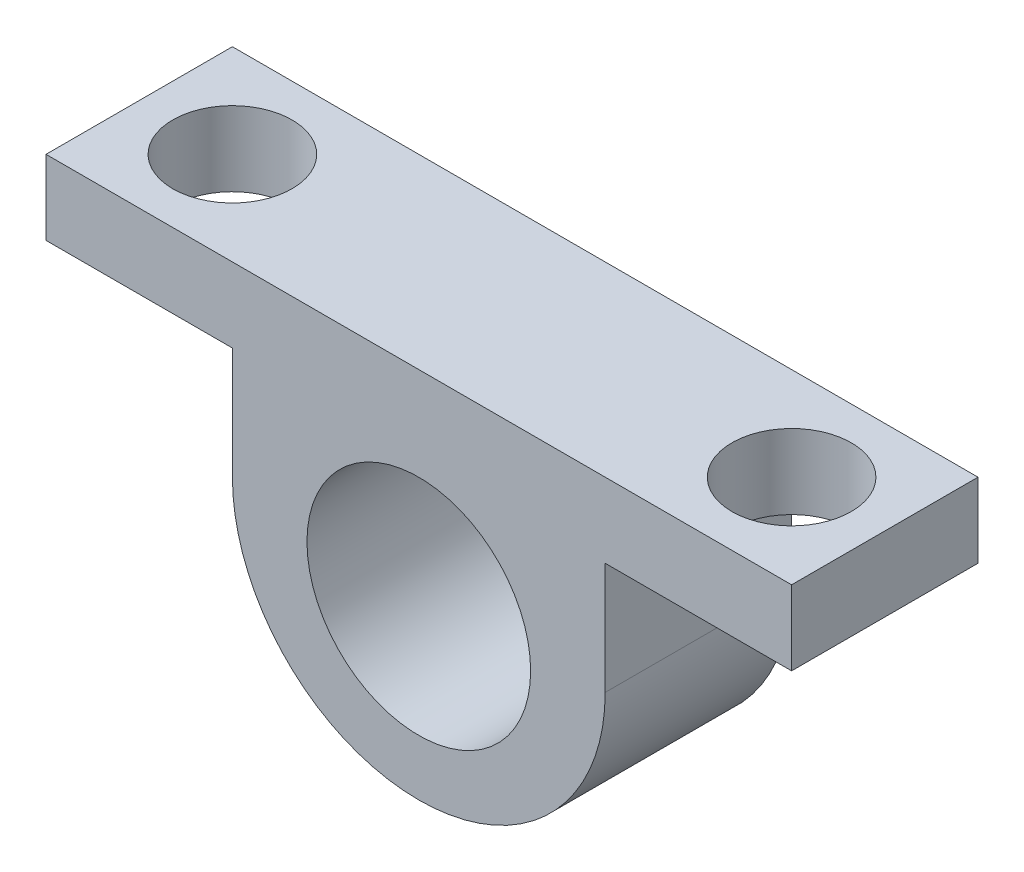
ISO-10303-21;
HEADER;
FILE_DESCRIPTION(('STEP AP214'),'2;1');
FILE_NAME('part.step','',(''),(''),'','','');
FILE_SCHEMA(('AUTOMOTIVE_DESIGN { 1 0 10303 214 1 1 1 1 }'));
ENDSEC;
DATA;
#1=APPLICATION_CONTEXT('core data for automotive mechanical design processes');
#2=APPLICATION_PROTOCOL_DEFINITION('international standard','automotive_design',2000,#1);
#3=PRODUCT_CONTEXT('',#1,'mechanical');
#4=PRODUCT('Part','Part','',(#3));
#5=PRODUCT_RELATED_PRODUCT_CATEGORY('part','',(#4));
#6=PRODUCT_DEFINITION_FORMATION('','',#4);
#7=PRODUCT_DEFINITION_CONTEXT('part definition',#1,'design');
#8=PRODUCT_DEFINITION('design','',#6,#7);
#9=PRODUCT_DEFINITION_SHAPE('','',#8);
#10=(LENGTH_UNIT() NAMED_UNIT(*) SI_UNIT(.MILLI.,.METRE.));
#11=(NAMED_UNIT(*) PLANE_ANGLE_UNIT() SI_UNIT($,.RADIAN.));
#12=(NAMED_UNIT(*) SI_UNIT($,.STERADIAN.) SOLID_ANGLE_UNIT());
#13=UNCERTAINTY_MEASURE_WITH_UNIT(LENGTH_MEASURE(1.E-05),#10,'distance_accuracy_value','');
#14=(GEOMETRIC_REPRESENTATION_CONTEXT(3) GLOBAL_UNCERTAINTY_ASSIGNED_CONTEXT((#13)) GLOBAL_UNIT_ASSIGNED_CONTEXT((#10,
#11,#12)) REPRESENTATION_CONTEXT('',''));
#15=CARTESIAN_POINT('',(0.,0.,0.));
#16=DIRECTION('',(0.,0.,1.));
#17=DIRECTION('',(1.,0.,0.));
#18=AXIS2_PLACEMENT_3D('',#15,#16,#17);
#19=CARTESIAN_POINT('',(-5.,-10.,2.5));
#20=DIRECTION('',(-1.,0.,0.));
#21=DIRECTION('',(0.,0.,1.));
#22=AXIS2_PLACEMENT_3D('',#19,#20,#21);
#23=PLANE('',#22);
#24=DIRECTION('',(0.,1.,0.));
#25=VECTOR('',#24,1.);
#26=CARTESIAN_POINT('',(-5.,-10.,-2.5));
#27=LINE('',#26,#25);
#28=CARTESIAN_POINT('',(-5.,-5.,-2.5));
#29=VERTEX_POINT('',#28);
#30=CARTESIAN_POINT('',(-5.,-2.,-2.5));
#31=VERTEX_POINT('',#30);
#32=EDGE_CURVE('E169',#29,#31,#27,.T.);
#33=ORIENTED_EDGE('',*,*,#32,.F.);
#34=DIRECTION('',(0.,0.,1.));
#35=VECTOR('',#34,1.);
#36=CARTESIAN_POINT('',(-5.,-5.,2.5));
#37=LINE('',#36,#35);
#38=CARTESIAN_POINT('',(-5.,-5.,2.5));
#39=VERTEX_POINT('',#38);
#40=EDGE_CURVE('E171',#29,#39,#37,.T.);
#41=ORIENTED_EDGE('',*,*,#40,.T.);
#42=DIRECTION('',(0.,1.,0.));
#43=VECTOR('',#42,1.);
#44=CARTESIAN_POINT('',(-5.,-10.,2.5));
#45=LINE('',#44,#43);
#46=CARTESIAN_POINT('',(-5.,-2.,2.5));
#47=VERTEX_POINT('',#46);
#48=EDGE_CURVE('E168',#39,#47,#45,.T.);
#49=ORIENTED_EDGE('',*,*,#48,.T.);
#50=DIRECTION('',(0.,0.,1.));
#51=VECTOR('',#50,1.);
#52=CARTESIAN_POINT('',(-5.,-2.,2.5));
#53=LINE('',#52,#51);
#54=EDGE_CURVE('E126',#31,#47,#53,.T.);
#55=ORIENTED_EDGE('',*,*,#54,.F.);
#56=EDGE_LOOP('',(#33,#41,#49,#55));
#57=FACE_BOUND('',#56,.T.);
#58=ADVANCED_FACE('F33',(#57),#23,.T.);
#59=CARTESIAN_POINT('',(5.,-10.,-2.5));
#60=DIRECTION('',(0.,0.,-1.));
#61=DIRECTION('',(-1.,0.,0.));
#62=AXIS2_PLACEMENT_3D('',#59,#60,#61);
#63=PLANE('',#62);
#64=CARTESIAN_POINT('',(0.,-5.,-2.5));
#65=DIRECTION('',(0.,0.,-1.));
#66=DIRECTION('',(-1.,0.,0.));
#67=AXIS2_PLACEMENT_3D('',#64,#65,#66);
#68=CIRCLE('',#67,5.);
#69=CARTESIAN_POINT('',(5.,-5.,-2.5));
#70=VERTEX_POINT('',#69);
#71=CARTESIAN_POINT('',(0.,-10.,-2.5));
#72=VERTEX_POINT('',#71);
#73=EDGE_CURVE('E49',#70,#72,#68,.T.);
#74=ORIENTED_EDGE('',*,*,#73,.T.);
#75=CARTESIAN_POINT('',(0.,-5.,-2.5));
#76=DIRECTION('',(0.,0.,-1.));
#77=DIRECTION('',(-1.,0.,0.));
#78=AXIS2_PLACEMENT_3D('',#75,#76,#77);
#79=CIRCLE('',#78,5.);
#80=EDGE_CURVE('E42',#72,#29,#79,.T.);
#81=ORIENTED_EDGE('',*,*,#80,.T.);
#82=ORIENTED_EDGE('',*,*,#32,.T.);
#83=DIRECTION('',(-1.,0.,0.));
#84=VECTOR('',#83,1.);
#85=CARTESIAN_POINT('',(10.,-2.,-2.5));
#86=LINE('',#85,#84);
#87=CARTESIAN_POINT('',(-10.,-2.,-2.5));
#88=VERTEX_POINT('',#87);
#89=EDGE_CURVE('E145',#31,#88,#86,.T.);
#90=ORIENTED_EDGE('',*,*,#89,.T.);
#91=DIRECTION('',(0.,1.,0.));
#92=VECTOR('',#91,1.);
#93=CARTESIAN_POINT('',(-10.,-2.,-2.5));
#94=LINE('',#93,#92);
#95=CARTESIAN_POINT('',(-10.,0.,-2.5));
#96=VERTEX_POINT('',#95);
#97=EDGE_CURVE('E133',#88,#96,#94,.T.);
#98=ORIENTED_EDGE('',*,*,#97,.T.);
#99=DIRECTION('',(-1.,0.,0.));
#100=VECTOR('',#99,1.);
#101=CARTESIAN_POINT('',(5.,0.,-2.5));
#102=LINE('',#101,#100);
#103=CARTESIAN_POINT('',(10.,0.,-2.5));
#104=VERTEX_POINT('',#103);
#105=EDGE_CURVE('E166',#104,#96,#102,.T.);
#106=ORIENTED_EDGE('',*,*,#105,.F.);
#107=DIRECTION('',(0.,1.,0.));
#108=VECTOR('',#107,1.);
#109=CARTESIAN_POINT('',(10.,-2.,-2.5));
#110=LINE('',#109,#108);
#111=CARTESIAN_POINT('',(10.,-2.,-2.5));
#112=VERTEX_POINT('',#111);
#113=EDGE_CURVE('E152',#112,#104,#110,.T.);
#114=ORIENTED_EDGE('',*,*,#113,.F.);
#115=CARTESIAN_POINT('',(5.,-2.,-2.5));
#116=VERTEX_POINT('',#115);
#117=EDGE_CURVE('E117',#112,#116,#86,.T.);
#118=ORIENTED_EDGE('',*,*,#117,.T.);
#119=DIRECTION('',(0.,1.,0.));
#120=VECTOR('',#119,1.);
#121=CARTESIAN_POINT('',(5.,-10.,-2.5));
#122=LINE('',#121,#120);
#123=EDGE_CURVE('E172',#70,#116,#122,.T.);
#124=ORIENTED_EDGE('',*,*,#123,.F.);
#125=EDGE_LOOP('',(#74,#81,#82,#90,#98,#106,#114,#118,#124));
#126=FACE_BOUND('',#125,.T.);
#127=CARTESIAN_POINT('',(0.,-5.5,-2.5));
#128=DIRECTION('',(0.,0.,-1.));
#129=DIRECTION('',(-1.,0.,0.));
#130=AXIS2_PLACEMENT_3D('',#127,#128,#129);
#131=CIRCLE('',#130,3.);
#132=CARTESIAN_POINT('',(-3.,-5.5,-2.5));
#133=VERTEX_POINT('',#132);
#134=EDGE_CURVE('E160',#133,#133,#131,.T.);
#135=ORIENTED_EDGE('',*,*,#134,.F.);
#136=EDGE_LOOP('',(#135));
#137=FACE_BOUND('',#136,.T.);
#138=ADVANCED_FACE('F186',(#126,#137),#63,.T.);
#139=CARTESIAN_POINT('',(5.,-10.,2.5));
#140=DIRECTION('',(1.,0.,0.));
#141=DIRECTION('',(0.,0.,-1.));
#142=AXIS2_PLACEMENT_3D('',#139,#140,#141);
#143=PLANE('',#142);
#144=DIRECTION('',(0.,1.,0.));
#145=VECTOR('',#144,1.);
#146=CARTESIAN_POINT('',(5.,-10.,2.5));
#147=LINE('',#146,#145);
#148=CARTESIAN_POINT('',(5.,-5.,2.5));
#149=VERTEX_POINT('',#148);
#150=CARTESIAN_POINT('',(5.,-2.,2.5));
#151=VERTEX_POINT('',#150);
#152=EDGE_CURVE('E174',#149,#151,#147,.T.);
#153=ORIENTED_EDGE('',*,*,#152,.F.);
#154=DIRECTION('',(0.,0.,-1.));
#155=VECTOR('',#154,1.);
#156=CARTESIAN_POINT('',(5.,-5.,-2.5));
#157=LINE('',#156,#155);
#158=EDGE_CURVE('E11',#149,#70,#157,.T.);
#159=ORIENTED_EDGE('',*,*,#158,.T.);
#160=ORIENTED_EDGE('',*,*,#123,.T.);
#161=DIRECTION('',(0.,0.,-1.));
#162=VECTOR('',#161,1.);
#163=CARTESIAN_POINT('',(5.,-2.,2.5));
#164=LINE('',#163,#162);
#165=EDGE_CURVE('E151',#151,#116,#164,.T.);
#166=ORIENTED_EDGE('',*,*,#165,.F.);
#167=EDGE_LOOP('',(#153,#159,#160,#166));
#168=FACE_BOUND('',#167,.T.);
#169=ADVANCED_FACE('F224',(#168),#143,.T.);
#170=CARTESIAN_POINT('',(5.,-10.,2.5));
#171=DIRECTION('',(0.,0.,1.));
#172=DIRECTION('',(1.,0.,0.));
#173=AXIS2_PLACEMENT_3D('',#170,#171,#172);
#174=PLANE('',#173);
#175=ORIENTED_EDGE('',*,*,#48,.F.);
#176=CARTESIAN_POINT('',(0.,-5.,2.5));
#177=DIRECTION('',(0.,0.,1.));
#178=DIRECTION('',(1.,0.,0.));
#179=AXIS2_PLACEMENT_3D('',#176,#177,#178);
#180=CIRCLE('',#179,5.);
#181=CARTESIAN_POINT('',(0.,-10.,2.5));
#182=VERTEX_POINT('',#181);
#183=EDGE_CURVE('E181',#39,#182,#180,.T.);
#184=ORIENTED_EDGE('',*,*,#183,.T.);
#185=CARTESIAN_POINT('',(0.,-5.,2.5));
#186=DIRECTION('',(0.,0.,1.));
#187=DIRECTION('',(1.,0.,0.));
#188=AXIS2_PLACEMENT_3D('',#185,#186,#187);
#189=CIRCLE('',#188,5.);
#190=EDGE_CURVE('E179',#182,#149,#189,.T.);
#191=ORIENTED_EDGE('',*,*,#190,.T.);
#192=ORIENTED_EDGE('',*,*,#152,.T.);
#193=DIRECTION('',(1.,0.,0.));
#194=VECTOR('',#193,1.);
#195=CARTESIAN_POINT('',(10.,-2.,2.5));
#196=LINE('',#195,#194);
#197=CARTESIAN_POINT('',(10.,-2.,2.5));
#198=VERTEX_POINT('',#197);
#199=EDGE_CURVE('E128',#151,#198,#196,.T.);
#200=ORIENTED_EDGE('',*,*,#199,.T.);
#201=DIRECTION('',(0.,1.,0.));
#202=VECTOR('',#201,1.);
#203=CARTESIAN_POINT('',(10.,-2.,2.5));
#204=LINE('',#203,#202);
#205=CARTESIAN_POINT('',(10.,0.,2.5));
#206=VERTEX_POINT('',#205);
#207=EDGE_CURVE('E116',#198,#206,#204,.T.);
#208=ORIENTED_EDGE('',*,*,#207,.T.);
#209=DIRECTION('',(1.,0.,0.));
#210=VECTOR('',#209,1.);
#211=CARTESIAN_POINT('',(5.,0.,2.5));
#212=LINE('',#211,#210);
#213=CARTESIAN_POINT('',(-10.,0.,2.5));
#214=VERTEX_POINT('',#213);
#215=EDGE_CURVE('E111',#214,#206,#212,.T.);
#216=ORIENTED_EDGE('',*,*,#215,.F.);
#217=DIRECTION('',(0.,1.,0.));
#218=VECTOR('',#217,1.);
#219=CARTESIAN_POINT('',(-10.,-2.,2.5));
#220=LINE('',#219,#218);
#221=CARTESIAN_POINT('',(-10.,-2.,2.5));
#222=VERTEX_POINT('',#221);
#223=EDGE_CURVE('E104',#222,#214,#220,.T.);
#224=ORIENTED_EDGE('',*,*,#223,.F.);
#225=EDGE_CURVE('E109',#222,#47,#196,.T.);
#226=ORIENTED_EDGE('',*,*,#225,.T.);
#227=EDGE_LOOP('',(#175,#184,#191,#192,#200,#208,#216,#224,#226));
#228=FACE_BOUND('',#227,.T.);
#229=CARTESIAN_POINT('',(0.,-5.5,2.5));
#230=DIRECTION('',(0.,0.,1.));
#231=DIRECTION('',(1.,0.,0.));
#232=AXIS2_PLACEMENT_3D('',#229,#230,#231);
#233=CIRCLE('',#232,3.);
#234=CARTESIAN_POINT('',(3.,-5.5,2.5));
#235=VERTEX_POINT('',#234);
#236=EDGE_CURVE('E159',#235,#235,#233,.F.);
#237=ORIENTED_EDGE('',*,*,#236,.T.);
#238=EDGE_LOOP('',(#237));
#239=FACE_BOUND('',#238,.T.);
#240=ADVANCED_FACE('F107',(#228,#239),#174,.T.);
#241=CARTESIAN_POINT('',(0.,0.,0.));
#242=DIRECTION('',(0.,1.,0.));
#243=DIRECTION('',(0.,0.,1.));
#244=AXIS2_PLACEMENT_3D('',#241,#242,#243);
#245=PLANE('',#244);
#246=ORIENTED_EDGE('',*,*,#105,.T.);
#247=DIRECTION('',(0.,0.,1.));
#248=VECTOR('',#247,1.);
#249=CARTESIAN_POINT('',(-10.,0.,-2.5));
#250=LINE('',#249,#248);
#251=EDGE_CURVE('E137',#96,#214,#250,.T.);
#252=ORIENTED_EDGE('',*,*,#251,.T.);
#253=ORIENTED_EDGE('',*,*,#215,.T.);
#254=DIRECTION('',(0.,0.,-1.));
#255=VECTOR('',#254,1.);
#256=CARTESIAN_POINT('',(10.,0.,-2.5));
#257=LINE('',#256,#255);
#258=EDGE_CURVE('E134',#206,#104,#257,.T.);
#259=ORIENTED_EDGE('',*,*,#258,.T.);
#260=EDGE_LOOP('',(#246,#252,#253,#259));
#261=FACE_BOUND('',#260,.T.);
#262=CARTESIAN_POINT('',(7.50000000000001,0.,1.11022302462516E-13));
#263=DIRECTION('',(0.,1.,0.));
#264=DIRECTION('',(0.,0.,1.));
#265=AXIS2_PLACEMENT_3D('',#262,#263,#264);
#266=CIRCLE('',#265,1.6);
#267=CARTESIAN_POINT('',(7.50000000000001,0.,1.60000000000011));
#268=VERTEX_POINT('',#267);
#269=EDGE_CURVE('E195',#268,#268,#266,.T.);
#270=ORIENTED_EDGE('',*,*,#269,.F.);
#271=EDGE_LOOP('',(#270));
#272=FACE_BOUND('',#271,.T.);
#273=CARTESIAN_POINT('',(-7.49999999999999,0.,1.11022302462516E-13));
#274=DIRECTION('',(0.,1.,0.));
#275=DIRECTION('',(0.,0.,1.));
#276=AXIS2_PLACEMENT_3D('',#273,#274,#275);
#277=CIRCLE('',#276,1.6);
#278=CARTESIAN_POINT('',(-7.49999999999999,0.,1.60000000000011));
#279=VERTEX_POINT('',#278);
#280=EDGE_CURVE('E140',#279,#279,#277,.T.);
#281=ORIENTED_EDGE('',*,*,#280,.F.);
#282=EDGE_LOOP('',(#281));
#283=FACE_BOUND('',#282,.T.);
#284=ADVANCED_FACE('F211',(#261,#272,#283),#245,.T.);
#285=CARTESIAN_POINT('',(0.,-5.5,2.501));
#286=DIRECTION('',(0.,0.,-1.));
#287=DIRECTION('',(-1.,0.,0.));
#288=AXIS2_PLACEMENT_3D('',#285,#286,#287);
#289=CYLINDRICAL_SURFACE('',#288,3.);
#290=ORIENTED_EDGE('',*,*,#236,.F.);
#291=EDGE_LOOP('',(#290));
#292=FACE_BOUND('',#291,.T.);
#293=ORIENTED_EDGE('',*,*,#134,.T.);
#294=EDGE_LOOP('',(#293));
#295=FACE_BOUND('',#294,.T.);
#296=ADVANCED_FACE('F213',(#292,#295),#289,.F.);
#297=CARTESIAN_POINT('',(7.50000000000001,-2.,1.11022302462516E-13));
#298=DIRECTION('',(0.,1.,0.));
#299=DIRECTION('',(0.,0.,1.));
#300=AXIS2_PLACEMENT_3D('',#297,#298,#299);
#301=CYLINDRICAL_SURFACE('',#300,1.6);
#302=CARTESIAN_POINT('',(7.50000000000001,-2.,1.11022302462516E-13));
#303=DIRECTION('',(0.,1.,0.));
#304=DIRECTION('',(0.,0.,1.));
#305=AXIS2_PLACEMENT_3D('',#302,#303,#304);
#306=CIRCLE('',#305,1.6);
#307=CARTESIAN_POINT('',(7.50000000000001,-2.,1.60000000000011));
#308=VERTEX_POINT('',#307);
#309=EDGE_CURVE('E197',#308,#308,#306,.T.);
#310=ORIENTED_EDGE('',*,*,#309,.F.);
#311=EDGE_LOOP('',(#310));
#312=FACE_BOUND('',#311,.T.);
#313=ORIENTED_EDGE('',*,*,#269,.T.);
#314=EDGE_LOOP('',(#313));
#315=FACE_BOUND('',#314,.T.);
#316=ADVANCED_FACE('F220',(#312,#315),#301,.F.);
#317=CARTESIAN_POINT('',(10.,-2.,-2.5));
#318=DIRECTION('',(1.,0.,0.));
#319=DIRECTION('',(0.,0.,-1.));
#320=AXIS2_PLACEMENT_3D('',#317,#318,#319);
#321=PLANE('',#320);
#322=ORIENTED_EDGE('',*,*,#258,.F.);
#323=ORIENTED_EDGE('',*,*,#207,.F.);
#324=DIRECTION('',(0.,0.,-1.));
#325=VECTOR('',#324,1.);
#326=CARTESIAN_POINT('',(10.,-2.,-2.5));
#327=LINE('',#326,#325);
#328=EDGE_CURVE('E127',#198,#112,#327,.T.);
#329=ORIENTED_EDGE('',*,*,#328,.T.);
#330=ORIENTED_EDGE('',*,*,#113,.T.);
#331=EDGE_LOOP('',(#322,#323,#329,#330));
#332=FACE_BOUND('',#331,.T.);
#333=ADVANCED_FACE('F252',(#332),#321,.T.);
#334=CARTESIAN_POINT('',(0.,-2.,0.));
#335=DIRECTION('',(0.,-1.,0.));
#336=DIRECTION('',(0.,0.,-1.));
#337=AXIS2_PLACEMENT_3D('',#334,#335,#336);
#338=PLANE('',#337);
#339=ORIENTED_EDGE('',*,*,#309,.T.);
#340=EDGE_LOOP('',(#339));
#341=FACE_BOUND('',#340,.T.);
#342=ORIENTED_EDGE('',*,*,#199,.F.);
#343=ORIENTED_EDGE('',*,*,#165,.T.);
#344=ORIENTED_EDGE('',*,*,#117,.F.);
#345=ORIENTED_EDGE('',*,*,#328,.F.);
#346=EDGE_LOOP('',(#342,#343,#344,#345));
#347=FACE_BOUND('',#346,.T.);
#348=ADVANCED_FACE('F249',(#341,#347),#338,.T.);
#349=CARTESIAN_POINT('',(-7.49999999999999,-2.,1.11022302462516E-13));
#350=DIRECTION('',(0.,1.,0.));
#351=DIRECTION('',(0.,0.,1.));
#352=AXIS2_PLACEMENT_3D('',#349,#350,#351);
#353=CIRCLE('',#352,1.6);
#354=CARTESIAN_POINT('',(-7.49999999999999,-2.,1.60000000000011));
#355=VERTEX_POINT('',#354);
#356=EDGE_CURVE('E148',#355,#355,#353,.T.);
#357=ORIENTED_EDGE('',*,*,#356,.T.);
#358=EDGE_LOOP('',(#357));
#359=FACE_BOUND('',#358,.T.);
#360=ORIENTED_EDGE('',*,*,#89,.F.);
#361=ORIENTED_EDGE('',*,*,#54,.T.);
#362=ORIENTED_EDGE('',*,*,#225,.F.);
#363=DIRECTION('',(0.,0.,1.));
#364=VECTOR('',#363,1.);
#365=CARTESIAN_POINT('',(-10.,-2.,-2.5));
#366=LINE('',#365,#364);
#367=EDGE_CURVE('E124',#88,#222,#366,.T.);
#368=ORIENTED_EDGE('',*,*,#367,.F.);
#369=EDGE_LOOP('',(#360,#361,#362,#368));
#370=FACE_BOUND('',#369,.T.);
#371=ADVANCED_FACE('F123',(#359,#370),#338,.T.);
#372=CARTESIAN_POINT('',(-10.,-2.,-2.5));
#373=DIRECTION('',(-1.,0.,0.));
#374=DIRECTION('',(0.,0.,1.));
#375=AXIS2_PLACEMENT_3D('',#372,#373,#374);
#376=PLANE('',#375);
#377=ORIENTED_EDGE('',*,*,#251,.F.);
#378=ORIENTED_EDGE('',*,*,#97,.F.);
#379=ORIENTED_EDGE('',*,*,#367,.T.);
#380=ORIENTED_EDGE('',*,*,#223,.T.);
#381=EDGE_LOOP('',(#377,#378,#379,#380));
#382=FACE_BOUND('',#381,.T.);
#383=ADVANCED_FACE('F131',(#382),#376,.T.);
#384=CARTESIAN_POINT('',(-7.49999999999999,-2.,1.11022302462516E-13));
#385=DIRECTION('',(0.,1.,0.));
#386=DIRECTION('',(0.,0.,1.));
#387=AXIS2_PLACEMENT_3D('',#384,#385,#386);
#388=CYLINDRICAL_SURFACE('',#387,1.6);
#389=ORIENTED_EDGE('',*,*,#356,.F.);
#390=EDGE_LOOP('',(#389));
#391=FACE_BOUND('',#390,.T.);
#392=ORIENTED_EDGE('',*,*,#280,.T.);
#393=EDGE_LOOP('',(#392));
#394=FACE_BOUND('',#393,.T.);
#395=ADVANCED_FACE('F209',(#391,#394),#388,.F.);
#396=CARTESIAN_POINT('',(0.,-5.,2.5));
#397=DIRECTION('',(0.,0.,1.));
#398=DIRECTION('',(1.,0.,0.));
#399=AXIS2_PLACEMENT_3D('',#396,#397,#398);
#400=CYLINDRICAL_SURFACE('',#399,5.);
#401=DIRECTION('',(0.,0.,-1.));
#402=VECTOR('',#401,1.);
#403=CARTESIAN_POINT('',(0.,-10.,2.5));
#404=LINE('',#403,#402);
#405=EDGE_CURVE('E37',#72,#182,#404,.F.);
#406=ORIENTED_EDGE('',*,*,#405,.F.);
#407=ORIENTED_EDGE('',*,*,#73,.F.);
#408=ORIENTED_EDGE('',*,*,#158,.F.);
#409=ORIENTED_EDGE('',*,*,#190,.F.);
#410=EDGE_LOOP('',(#406,#407,#408,#409));
#411=FACE_BOUND('',#410,.T.);
#412=ADVANCED_FACE('F35',(#411),#400,.T.);
#413=CARTESIAN_POINT('',(0.,-5.,2.5));
#414=DIRECTION('',(0.,0.,-1.));
#415=DIRECTION('',(-1.,0.,0.));
#416=AXIS2_PLACEMENT_3D('',#413,#414,#415);
#417=CYLINDRICAL_SURFACE('',#416,5.);
#418=ORIENTED_EDGE('',*,*,#80,.F.);
#419=ORIENTED_EDGE('',*,*,#405,.T.);
#420=ORIENTED_EDGE('',*,*,#183,.F.);
#421=ORIENTED_EDGE('',*,*,#40,.F.);
#422=EDGE_LOOP('',(#418,#419,#420,#421));
#423=FACE_BOUND('',#422,.T.);
#424=ADVANCED_FACE('F192',(#423),#417,.T.);
#425=CLOSED_SHELL('',(#58,#138,#169,#240,#284,#296,#316,#333,#348,#371,#383,#395,#412,#424));
#426=MANIFOLD_SOLID_BREP('B2',#425);
#427=ADVANCED_BREP_SHAPE_REPRESENTATION('',(#18,#426),#14);
#428=SHAPE_DEFINITION_REPRESENTATION(#9,#427);
ENDSEC;
END-ISO-10303-21;
